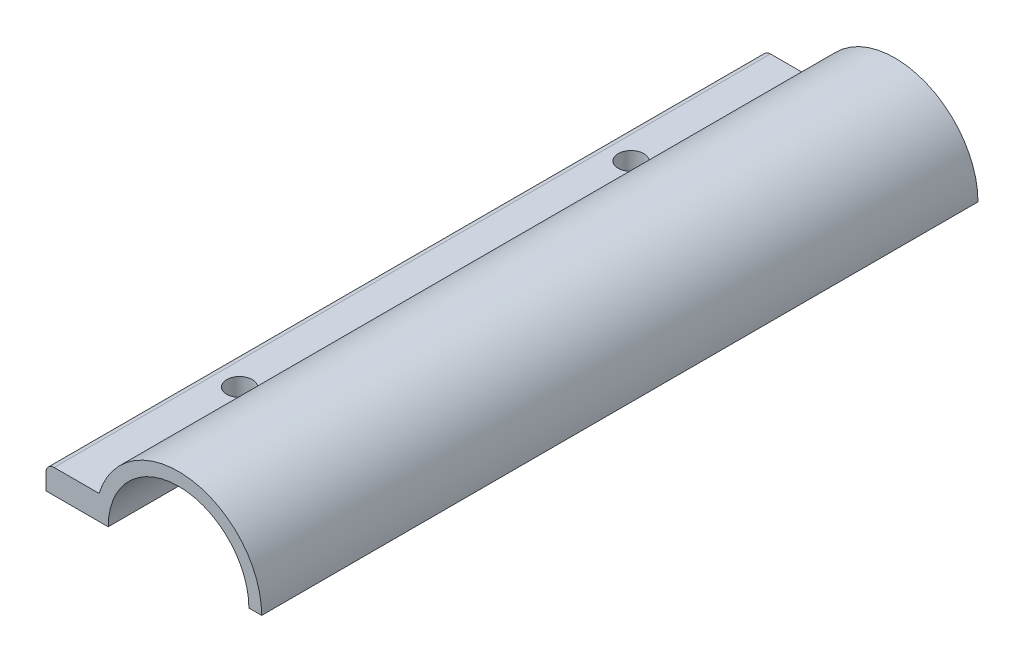
ISO-10303-21;
HEADER;
FILE_DESCRIPTION(('STEP AP214'),'2;1');
FILE_NAME('part.step','',(''),(''),'','','');
FILE_SCHEMA(('AUTOMOTIVE_DESIGN { 1 0 10303 214 1 1 1 1 }'));
ENDSEC;
DATA;
#1=APPLICATION_CONTEXT('core data for automotive mechanical design processes');
#2=APPLICATION_PROTOCOL_DEFINITION('international standard','automotive_design',2000,#1);
#3=PRODUCT_CONTEXT('',#1,'mechanical');
#4=PRODUCT('Part','Part','',(#3));
#5=PRODUCT_RELATED_PRODUCT_CATEGORY('part','',(#4));
#6=PRODUCT_DEFINITION_FORMATION('','',#4);
#7=PRODUCT_DEFINITION_CONTEXT('part definition',#1,'design');
#8=PRODUCT_DEFINITION('design','',#6,#7);
#9=PRODUCT_DEFINITION_SHAPE('','',#8);
#10=(LENGTH_UNIT() NAMED_UNIT(*) SI_UNIT(.MILLI.,.METRE.));
#11=(NAMED_UNIT(*) PLANE_ANGLE_UNIT() SI_UNIT($,.RADIAN.));
#12=(NAMED_UNIT(*) SI_UNIT($,.STERADIAN.) SOLID_ANGLE_UNIT());
#13=UNCERTAINTY_MEASURE_WITH_UNIT(LENGTH_MEASURE(1.E-05),#10,'distance_accuracy_value','');
#14=(GEOMETRIC_REPRESENTATION_CONTEXT(3) GLOBAL_UNCERTAINTY_ASSIGNED_CONTEXT((#13)) GLOBAL_UNIT_ASSIGNED_CONTEXT((#10,
#11,#12)) REPRESENTATION_CONTEXT('',''));
#15=CARTESIAN_POINT('',(0.,0.,0.));
#16=DIRECTION('',(0.,0.,1.));
#17=DIRECTION('',(1.,0.,0.));
#18=AXIS2_PLACEMENT_3D('',#15,#16,#17);
#19=CARTESIAN_POINT('',(0.,0.,112.));
#20=DIRECTION('',(0.,0.,-1.));
#21=DIRECTION('',(-1.,0.,0.));
#22=AXIS2_PLACEMENT_3D('',#19,#20,#21);
#23=CYLINDRICAL_SURFACE('',#22,11.);
#24=CARTESIAN_POINT('',(0.,0.,0.));
#25=DIRECTION('',(0.,0.,1.));
#26=DIRECTION('',(1.,0.,0.));
#27=AXIS2_PLACEMENT_3D('',#24,#25,#26);
#28=CIRCLE('',#27,11.);
#29=CARTESIAN_POINT('',(11.,0.,0.));
#30=VERTEX_POINT('',#29);
#31=CARTESIAN_POINT('',(-11.,0.,0.));
#32=VERTEX_POINT('',#31);
#33=EDGE_CURVE('E105',#30,#32,#28,.T.);
#34=ORIENTED_EDGE('',*,*,#33,.F.);
#35=DIRECTION('',(0.,0.,-1.));
#36=VECTOR('',#35,1.);
#37=CARTESIAN_POINT('',(11.,0.,112.));
#38=LINE('',#37,#36);
#39=CARTESIAN_POINT('',(11.,0.,112.));
#40=VERTEX_POINT('',#39);
#41=EDGE_CURVE('E100',#40,#30,#38,.T.);
#42=ORIENTED_EDGE('',*,*,#41,.F.);
#43=CARTESIAN_POINT('',(0.,0.,112.));
#44=DIRECTION('',(0.,0.,1.));
#45=DIRECTION('',(1.,0.,0.));
#46=AXIS2_PLACEMENT_3D('',#43,#44,#45);
#47=CIRCLE('',#46,11.);
#48=CARTESIAN_POINT('',(-11.,0.,112.));
#49=VERTEX_POINT('',#48);
#50=EDGE_CURVE('E103',#40,#49,#47,.T.);
#51=ORIENTED_EDGE('',*,*,#50,.T.);
#52=DIRECTION('',(0.,0.,-1.));
#53=VECTOR('',#52,1.);
#54=CARTESIAN_POINT('',(-11.,0.,112.));
#55=LINE('',#54,#53);
#56=EDGE_CURVE('E147',#49,#32,#55,.T.);
#57=ORIENTED_EDGE('',*,*,#56,.T.);
#58=EDGE_LOOP('',(#34,#42,#51,#57));
#59=FACE_BOUND('',#58,.T.);
#60=ADVANCED_FACE('F43',(#59),#23,.F.);
#61=CARTESIAN_POINT('',(0.,0.,112.));
#62=DIRECTION('',(0.,1.,0.));
#63=DIRECTION('',(0.,0.,1.));
#64=AXIS2_PLACEMENT_3D('',#61,#62,#63);
#65=PLANE('',#64);
#66=DIRECTION('',(1.,0.,0.));
#67=VECTOR('',#66,1.);
#68=CARTESIAN_POINT('',(0.,0.,0.));
#69=LINE('',#68,#67);
#70=CARTESIAN_POINT('',(13.,0.,0.));
#71=VERTEX_POINT('',#70);
#72=EDGE_CURVE('E129',#30,#71,#69,.T.);
#73=ORIENTED_EDGE('',*,*,#72,.T.);
#74=DIRECTION('',(0.,0.,-1.));
#75=VECTOR('',#74,1.);
#76=CARTESIAN_POINT('',(13.,0.,112.));
#77=LINE('',#76,#75);
#78=CARTESIAN_POINT('',(13.,0.,112.));
#79=VERTEX_POINT('',#78);
#80=EDGE_CURVE('E109',#79,#71,#77,.T.);
#81=ORIENTED_EDGE('',*,*,#80,.F.);
#82=DIRECTION('',(1.,0.,0.));
#83=VECTOR('',#82,1.);
#84=CARTESIAN_POINT('',(0.,0.,112.));
#85=LINE('',#84,#83);
#86=EDGE_CURVE('E112',#40,#79,#85,.T.);
#87=ORIENTED_EDGE('',*,*,#86,.F.);
#88=ORIENTED_EDGE('',*,*,#41,.T.);
#89=EDGE_LOOP('',(#73,#81,#87,#88));
#90=FACE_BOUND('',#89,.T.);
#91=ADVANCED_FACE('F113',(#90),#65,.F.);
#92=CARTESIAN_POINT('',(0.,0.,112.));
#93=DIRECTION('',(0.,0.,-1.));
#94=DIRECTION('',(-1.,0.,0.));
#95=AXIS2_PLACEMENT_3D('',#92,#93,#94);
#96=CYLINDRICAL_SURFACE('',#95,13.);
#97=CARTESIAN_POINT('',(0.,0.,0.));
#98=DIRECTION('',(0.,0.,1.));
#99=DIRECTION('',(1.,0.,0.));
#100=AXIS2_PLACEMENT_3D('',#97,#98,#99);
#101=CIRCLE('',#100,13.);
#102=CARTESIAN_POINT('',(-12.4291552408038,3.81,0.));
#103=VERTEX_POINT('',#102);
#104=EDGE_CURVE('E141',#71,#103,#101,.T.);
#105=ORIENTED_EDGE('',*,*,#104,.T.);
#106=DIRECTION('',(0.,0.,-1.));
#107=VECTOR('',#106,1.);
#108=CARTESIAN_POINT('',(-12.4291552408038,3.81,112.));
#109=LINE('',#108,#107);
#110=CARTESIAN_POINT('',(-12.4291552408038,3.81,112.));
#111=VERTEX_POINT('',#110);
#112=EDGE_CURVE('E152',#111,#103,#109,.T.);
#113=ORIENTED_EDGE('',*,*,#112,.F.);
#114=CARTESIAN_POINT('',(0.,0.,112.));
#115=DIRECTION('',(0.,0.,1.));
#116=DIRECTION('',(1.,0.,0.));
#117=AXIS2_PLACEMENT_3D('',#114,#115,#116);
#118=CIRCLE('',#117,13.);
#119=EDGE_CURVE('E118',#79,#111,#118,.T.);
#120=ORIENTED_EDGE('',*,*,#119,.F.);
#121=ORIENTED_EDGE('',*,*,#80,.T.);
#122=EDGE_LOOP('',(#105,#113,#120,#121));
#123=FACE_BOUND('',#122,.T.);
#124=ADVANCED_FACE('F185',(#123),#96,.T.);
#125=CARTESIAN_POINT('',(0.,3.81,112.));
#126=DIRECTION('',(0.,1.,0.));
#127=DIRECTION('',(0.,0.,1.));
#128=AXIS2_PLACEMENT_3D('',#125,#126,#127);
#129=PLANE('',#128);
#130=CARTESIAN_POINT('',(-15.862228892637,3.81,25.4));
#131=DIRECTION('',(0.,1.,0.));
#132=DIRECTION('',(0.,0.,1.));
#133=AXIS2_PLACEMENT_3D('',#130,#131,#132);
#134=CIRCLE('',#133,2.);
#135=CARTESIAN_POINT('',(-15.862228892637,3.81,27.4));
#136=VERTEX_POINT('',#135);
#137=EDGE_CURVE('E200',#136,#136,#134,.T.);
#138=ORIENTED_EDGE('',*,*,#137,.F.);
#139=EDGE_LOOP('',(#138));
#140=FACE_BOUND('',#139,.T.);
#141=CARTESIAN_POINT('',(-15.862228892637,3.81,86.6));
#142=DIRECTION('',(0.,1.,0.));
#143=DIRECTION('',(0.,0.,1.));
#144=AXIS2_PLACEMENT_3D('',#141,#142,#143);
#145=CIRCLE('',#144,2.);
#146=CARTESIAN_POINT('',(-15.862228892637,3.81,88.6));
#147=VERTEX_POINT('',#146);
#148=EDGE_CURVE('E203',#147,#147,#145,.T.);
#149=ORIENTED_EDGE('',*,*,#148,.F.);
#150=EDGE_LOOP('',(#149));
#151=FACE_BOUND('',#150,.T.);
#152=DIRECTION('',(1.,0.,0.));
#153=VECTOR('',#152,1.);
#154=CARTESIAN_POINT('',(0.,3.81,0.));
#155=LINE('',#154,#153);
#156=CARTESIAN_POINT('',(-19.4544577852741,3.81,0.));
#157=VERTEX_POINT('',#156);
#158=EDGE_CURVE('E144',#157,#103,#155,.T.);
#159=ORIENTED_EDGE('',*,*,#158,.F.);
#160=DIRECTION('',(0.,0.,-1.));
#161=VECTOR('',#160,1.);
#162=CARTESIAN_POINT('',(-19.4544577852741,3.81,112.));
#163=LINE('',#162,#161);
#164=CARTESIAN_POINT('',(-19.4544577852741,3.81,112.));
#165=VERTEX_POINT('',#164);
#166=EDGE_CURVE('E51',#157,#165,#163,.F.);
#167=ORIENTED_EDGE('',*,*,#166,.T.);
#168=DIRECTION('',(1.,0.,0.));
#169=VECTOR('',#168,1.);
#170=CARTESIAN_POINT('',(0.,3.81,112.));
#171=LINE('',#170,#169);
#172=EDGE_CURVE('E135',#165,#111,#171,.T.);
#173=ORIENTED_EDGE('',*,*,#172,.T.);
#174=ORIENTED_EDGE('',*,*,#112,.T.);
#175=EDGE_LOOP('',(#159,#167,#173,#174));
#176=FACE_BOUND('',#175,.T.);
#177=ADVANCED_FACE('F179',(#140,#151,#176),#129,.T.);
#178=CARTESIAN_POINT('',(-20.7244577852741,0.,112.));
#179=DIRECTION('',(1.,0.,0.));
#180=DIRECTION('',(0.,0.,-1.));
#181=AXIS2_PLACEMENT_3D('',#178,#179,#180);
#182=PLANE('',#181);
#183=DIRECTION('',(0.,-1.,0.));
#184=VECTOR('',#183,1.);
#185=CARTESIAN_POINT('',(-20.7244577852741,0.,112.));
#186=LINE('',#185,#184);
#187=CARTESIAN_POINT('',(-20.7244577852741,2.54,112.));
#188=VERTEX_POINT('',#187);
#189=CARTESIAN_POINT('',(-20.7244577852741,0.,112.));
#190=VERTEX_POINT('',#189);
#191=EDGE_CURVE('E137',#188,#190,#186,.T.);
#192=ORIENTED_EDGE('',*,*,#191,.F.);
#193=DIRECTION('',(0.,0.,-1.));
#194=VECTOR('',#193,1.);
#195=CARTESIAN_POINT('',(-20.7244577852741,2.54,0.));
#196=LINE('',#195,#194);
#197=CARTESIAN_POINT('',(-20.7244577852741,2.54,0.));
#198=VERTEX_POINT('',#197);
#199=EDGE_CURVE('E108',#188,#198,#196,.T.);
#200=ORIENTED_EDGE('',*,*,#199,.T.);
#201=DIRECTION('',(0.,-1.,0.));
#202=VECTOR('',#201,1.);
#203=CARTESIAN_POINT('',(-20.7244577852741,0.,0.));
#204=LINE('',#203,#202);
#205=CARTESIAN_POINT('',(-20.7244577852741,0.,0.));
#206=VERTEX_POINT('',#205);
#207=EDGE_CURVE('E127',#198,#206,#204,.T.);
#208=ORIENTED_EDGE('',*,*,#207,.T.);
#209=DIRECTION('',(0.,0.,-1.));
#210=VECTOR('',#209,1.);
#211=CARTESIAN_POINT('',(-20.7244577852741,0.,112.));
#212=LINE('',#211,#210);
#213=EDGE_CURVE('E149',#190,#206,#212,.T.);
#214=ORIENTED_EDGE('',*,*,#213,.F.);
#215=EDGE_LOOP('',(#192,#200,#208,#214));
#216=FACE_BOUND('',#215,.T.);
#217=ADVANCED_FACE('F161',(#216),#182,.F.);
#218=CARTESIAN_POINT('',(-15.862228892637,0.,25.4));
#219=DIRECTION('',(0.,1.,0.));
#220=DIRECTION('',(0.,0.,1.));
#221=AXIS2_PLACEMENT_3D('',#218,#219,#220);
#222=CIRCLE('',#221,2.);
#223=CARTESIAN_POINT('',(-15.862228892637,0.,27.4));
#224=VERTEX_POINT('',#223);
#225=EDGE_CURVE('E139',#224,#224,#222,.T.);
#226=ORIENTED_EDGE('',*,*,#225,.T.);
#227=EDGE_LOOP('',(#226));
#228=FACE_BOUND('',#227,.T.);
#229=CARTESIAN_POINT('',(-15.862228892637,0.,86.6));
#230=DIRECTION('',(0.,1.,0.));
#231=DIRECTION('',(0.,0.,1.));
#232=AXIS2_PLACEMENT_3D('',#229,#230,#231);
#233=CIRCLE('',#232,2.);
#234=CARTESIAN_POINT('',(-15.862228892637,0.,88.6));
#235=VERTEX_POINT('',#234);
#236=EDGE_CURVE('E131',#235,#235,#233,.T.);
#237=ORIENTED_EDGE('',*,*,#236,.T.);
#238=EDGE_LOOP('',(#237));
#239=FACE_BOUND('',#238,.T.);
#240=EDGE_CURVE('E124',#206,#32,#69,.T.);
#241=ORIENTED_EDGE('',*,*,#240,.T.);
#242=ORIENTED_EDGE('',*,*,#56,.F.);
#243=EDGE_CURVE('E120',#190,#49,#85,.T.);
#244=ORIENTED_EDGE('',*,*,#243,.F.);
#245=ORIENTED_EDGE('',*,*,#213,.T.);
#246=EDGE_LOOP('',(#241,#242,#244,#245));
#247=FACE_BOUND('',#246,.T.);
#248=ADVANCED_FACE('F168',(#228,#239,#247),#65,.F.);
#249=CARTESIAN_POINT('',(0.,0.,112.));
#250=DIRECTION('',(0.,0.,1.));
#251=DIRECTION('',(1.,0.,0.));
#252=AXIS2_PLACEMENT_3D('',#249,#250,#251);
#253=PLANE('',#252);
#254=ORIENTED_EDGE('',*,*,#172,.F.);
#255=CARTESIAN_POINT('',(-19.4544577852741,2.54,112.));
#256=DIRECTION('',(0.,0.,1.));
#257=DIRECTION('',(1.,0.,0.));
#258=AXIS2_PLACEMENT_3D('',#255,#256,#257);
#259=CIRCLE('',#258,1.27);
#260=EDGE_CURVE('E11',#165,#188,#259,.T.);
#261=ORIENTED_EDGE('',*,*,#260,.T.);
#262=ORIENTED_EDGE('',*,*,#191,.T.);
#263=ORIENTED_EDGE('',*,*,#243,.T.);
#264=ORIENTED_EDGE('',*,*,#50,.F.);
#265=ORIENTED_EDGE('',*,*,#86,.T.);
#266=ORIENTED_EDGE('',*,*,#119,.T.);
#267=EDGE_LOOP('',(#254,#261,#262,#263,#264,#265,#266));
#268=FACE_BOUND('',#267,.T.);
#269=ADVANCED_FACE('F121',(#268),#253,.T.);
#270=CARTESIAN_POINT('',(0.,0.,0.));
#271=DIRECTION('',(0.,0.,1.));
#272=DIRECTION('',(1.,0.,0.));
#273=AXIS2_PLACEMENT_3D('',#270,#271,#272);
#274=PLANE('',#273);
#275=ORIENTED_EDGE('',*,*,#207,.F.);
#276=CARTESIAN_POINT('',(-19.4544577852741,2.54,0.));
#277=DIRECTION('',(0.,0.,1.));
#278=DIRECTION('',(1.,0.,0.));
#279=AXIS2_PLACEMENT_3D('',#276,#277,#278);
#280=CIRCLE('',#279,1.27);
#281=EDGE_CURVE('E65',#198,#157,#280,.F.);
#282=ORIENTED_EDGE('',*,*,#281,.T.);
#283=ORIENTED_EDGE('',*,*,#158,.T.);
#284=ORIENTED_EDGE('',*,*,#104,.F.);
#285=ORIENTED_EDGE('',*,*,#72,.F.);
#286=ORIENTED_EDGE('',*,*,#33,.T.);
#287=ORIENTED_EDGE('',*,*,#240,.F.);
#288=EDGE_LOOP('',(#275,#282,#283,#284,#285,#286,#287));
#289=FACE_BOUND('',#288,.T.);
#290=ADVANCED_FACE('F166',(#289),#274,.F.);
#291=CARTESIAN_POINT('',(-15.862228892637,0.,86.6));
#292=DIRECTION('',(0.,1.,0.));
#293=DIRECTION('',(0.,0.,1.));
#294=AXIS2_PLACEMENT_3D('',#291,#292,#293);
#295=CYLINDRICAL_SURFACE('',#294,2.);
#296=CARTESIAN_POINT('',(-15.862228892637,0.,88.6));
#297=CARTESIAN_POINT('',(-15.862228892637,0.039687499999999,88.6));
#298=CARTESIAN_POINT('',(-15.862228892637,0.0793749999999991,88.6));
#299=CARTESIAN_POINT('',(-15.862228892637,0.158749999999999,88.6));
#300=CARTESIAN_POINT('',(-15.862228892637,0.198437499999999,88.6));
#301=CARTESIAN_POINT('',(-15.862228892637,0.277812499999999,88.6));
#302=CARTESIAN_POINT('',(-15.862228892637,0.317499999999999,88.6));
#303=CARTESIAN_POINT('',(-15.862228892637,0.396874999999999,88.6));
#304=CARTESIAN_POINT('',(-15.862228892637,0.436562499999999,88.6));
#305=CARTESIAN_POINT('',(-15.862228892637,0.515937499999999,88.6));
#306=CARTESIAN_POINT('',(-15.862228892637,0.555624999999999,88.6));
#307=CARTESIAN_POINT('',(-15.862228892637,0.634999999999999,88.6));
#308=CARTESIAN_POINT('',(-15.862228892637,0.674687499999999,88.6));
#309=CARTESIAN_POINT('',(-15.862228892637,0.754062499999999,88.6));
#310=CARTESIAN_POINT('',(-15.862228892637,0.793749999999999,88.6));
#311=CARTESIAN_POINT('',(-15.862228892637,0.873124999999999,88.6));
#312=CARTESIAN_POINT('',(-15.862228892637,0.912812499999999,88.6));
#313=CARTESIAN_POINT('',(-15.862228892637,0.992187499999999,88.6));
#314=CARTESIAN_POINT('',(-15.862228892637,1.031875,88.6));
#315=CARTESIAN_POINT('',(-15.862228892637,1.11125,88.6));
#316=CARTESIAN_POINT('',(-15.862228892637,1.1509375,88.6));
#317=CARTESIAN_POINT('',(-15.862228892637,1.2303125,88.6));
#318=CARTESIAN_POINT('',(-15.862228892637,1.27,88.6));
#319=CARTESIAN_POINT('',(-15.862228892637,1.349375,88.6));
#320=CARTESIAN_POINT('',(-15.862228892637,1.3890625,88.6));
#321=CARTESIAN_POINT('',(-15.862228892637,1.4684375,88.6));
#322=CARTESIAN_POINT('',(-15.862228892637,1.508125,88.6));
#323=CARTESIAN_POINT('',(-15.862228892637,1.5875,88.6));
#324=CARTESIAN_POINT('',(-15.862228892637,1.6271875,88.6));
#325=CARTESIAN_POINT('',(-15.862228892637,1.7065625,88.6));
#326=CARTESIAN_POINT('',(-15.862228892637,1.74625,88.6));
#327=CARTESIAN_POINT('',(-15.862228892637,1.825625,88.6));
#328=CARTESIAN_POINT('',(-15.862228892637,1.8653125,88.6));
#329=CARTESIAN_POINT('',(-15.862228892637,1.9446875,88.6));
#330=CARTESIAN_POINT('',(-15.862228892637,1.984375,88.6));
#331=CARTESIAN_POINT('',(-15.862228892637,2.06375,88.6));
#332=CARTESIAN_POINT('',(-15.862228892637,2.1034375,88.6));
#333=CARTESIAN_POINT('',(-15.862228892637,2.1828125,88.6));
#334=CARTESIAN_POINT('',(-15.862228892637,2.2225,88.6));
#335=CARTESIAN_POINT('',(-15.862228892637,2.301875,88.6));
#336=CARTESIAN_POINT('',(-15.862228892637,2.3415625,88.6));
#337=CARTESIAN_POINT('',(-15.862228892637,2.4209375,88.6));
#338=CARTESIAN_POINT('',(-15.862228892637,2.460625,88.6));
#339=CARTESIAN_POINT('',(-15.862228892637,2.54,88.6));
#340=CARTESIAN_POINT('',(-15.862228892637,2.5796875,88.6));
#341=CARTESIAN_POINT('',(-15.862228892637,2.6590625,88.6));
#342=CARTESIAN_POINT('',(-15.862228892637,2.69875,88.6));
#343=CARTESIAN_POINT('',(-15.862228892637,2.778125,88.6));
#344=CARTESIAN_POINT('',(-15.862228892637,2.8178125,88.6));
#345=CARTESIAN_POINT('',(-15.862228892637,2.8971875,88.6));
#346=CARTESIAN_POINT('',(-15.862228892637,2.936875,88.6));
#347=CARTESIAN_POINT('',(-15.862228892637,3.01625,88.6));
#348=CARTESIAN_POINT('',(-15.862228892637,3.0559375,88.6));
#349=CARTESIAN_POINT('',(-15.862228892637,3.1353125,88.6));
#350=CARTESIAN_POINT('',(-15.862228892637,3.175,88.6));
#351=CARTESIAN_POINT('',(-15.862228892637,3.254375,88.6));
#352=CARTESIAN_POINT('',(-15.862228892637,3.2940625,88.6));
#353=CARTESIAN_POINT('',(-15.862228892637,3.3734375,88.6));
#354=CARTESIAN_POINT('',(-15.862228892637,3.413125,88.6));
#355=CARTESIAN_POINT('',(-15.862228892637,3.4925,88.6));
#356=CARTESIAN_POINT('',(-15.862228892637,3.5321875,88.6));
#357=CARTESIAN_POINT('',(-15.862228892637,3.6115625,88.6));
#358=CARTESIAN_POINT('',(-15.862228892637,3.65125,88.6));
#359=CARTESIAN_POINT('',(-15.862228892637,3.730625,88.6));
#360=CARTESIAN_POINT('',(-15.862228892637,3.7703125,88.6));
#361=CARTESIAN_POINT('',(-15.862228892637,3.81,88.6));
#362=B_SPLINE_CURVE_WITH_KNOTS('',3,(#296,#297,#298,#299,#300,#301,#302,#303,#304,#305,#306,
#307,#308,#309,#310,#311,#312,#313,#314,#315,#316,#317,#318,#319,#320,#321,#322,#323,#324,#325,
#326,#327,#328,#329,#330,#331,#332,#333,#334,#335,#336,#337,#338,#339,#340,#341,#342,#343,#344,
#345,#346,#347,#348,#349,#350,#351,#352,#353,#354,#355,#356,#357,#358,#359,#360,#361),
.UNSPECIFIED.,.F.,.F.,(4,2,2,2,2,2,2,2,2,2,2,2,2,2,2,2,2,2,2,2,2,2,2,2,2,2,2,2,2,2,2,2,4),(0.,
0.1190625,0.238125,0.3571875,0.47625,0.5953125,0.714375,0.8334375,0.9525,1.0715625,1.190625,
1.3096875,1.42875,1.5478125,1.666875,1.7859375,1.905,2.0240625,2.143125,2.2621875,2.38125,
2.5003125,2.619375,2.7384375,2.8575,2.9765625,3.095625,3.2146875,3.33375,3.4528125,3.571875,
3.6909375,3.81),.UNSPECIFIED.);
#363=EDGE_CURVE('BSEAM211',#235,#147,#362,.T.);
#364=ORIENTED_EDGE('',*,*,#236,.F.);
#365=ORIENTED_EDGE('',*,*,#148,.T.);
#366=ORIENTED_EDGE('',*,*,#363,.T.);
#367=ORIENTED_EDGE('',*,*,#363,.F.);
#368=EDGE_LOOP('',(#364,#366,#365,#367));
#369=FACE_BOUND('',#368,.T.);
#370=ADVANCED_FACE('F211',(#369),#295,.F.);
#371=CARTESIAN_POINT('',(-15.862228892637,0.,25.4));
#372=DIRECTION('',(0.,1.,0.));
#373=DIRECTION('',(0.,0.,1.));
#374=AXIS2_PLACEMENT_3D('',#371,#372,#373);
#375=CYLINDRICAL_SURFACE('',#374,2.);
#376=CARTESIAN_POINT('',(-15.862228892637,0.,27.4));
#377=CARTESIAN_POINT('',(-15.862228892637,0.039687499999999,27.4));
#378=CARTESIAN_POINT('',(-15.862228892637,0.0793749999999991,27.4));
#379=CARTESIAN_POINT('',(-15.862228892637,0.158749999999999,27.4));
#380=CARTESIAN_POINT('',(-15.862228892637,0.198437499999999,27.4));
#381=CARTESIAN_POINT('',(-15.862228892637,0.277812499999999,27.4));
#382=CARTESIAN_POINT('',(-15.862228892637,0.317499999999999,27.4));
#383=CARTESIAN_POINT('',(-15.862228892637,0.396874999999999,27.4));
#384=CARTESIAN_POINT('',(-15.862228892637,0.436562499999999,27.4));
#385=CARTESIAN_POINT('',(-15.862228892637,0.515937499999999,27.4));
#386=CARTESIAN_POINT('',(-15.862228892637,0.555624999999999,27.4));
#387=CARTESIAN_POINT('',(-15.862228892637,0.634999999999999,27.4));
#388=CARTESIAN_POINT('',(-15.862228892637,0.674687499999999,27.4));
#389=CARTESIAN_POINT('',(-15.862228892637,0.754062499999999,27.4));
#390=CARTESIAN_POINT('',(-15.862228892637,0.793749999999999,27.4));
#391=CARTESIAN_POINT('',(-15.862228892637,0.873124999999999,27.4));
#392=CARTESIAN_POINT('',(-15.862228892637,0.912812499999999,27.4));
#393=CARTESIAN_POINT('',(-15.862228892637,0.992187499999999,27.4));
#394=CARTESIAN_POINT('',(-15.862228892637,1.031875,27.4));
#395=CARTESIAN_POINT('',(-15.862228892637,1.11125,27.4));
#396=CARTESIAN_POINT('',(-15.862228892637,1.1509375,27.4));
#397=CARTESIAN_POINT('',(-15.862228892637,1.2303125,27.4));
#398=CARTESIAN_POINT('',(-15.862228892637,1.27,27.4));
#399=CARTESIAN_POINT('',(-15.862228892637,1.349375,27.4));
#400=CARTESIAN_POINT('',(-15.862228892637,1.3890625,27.4));
#401=CARTESIAN_POINT('',(-15.862228892637,1.4684375,27.4));
#402=CARTESIAN_POINT('',(-15.862228892637,1.508125,27.4));
#403=CARTESIAN_POINT('',(-15.862228892637,1.5875,27.4));
#404=CARTESIAN_POINT('',(-15.862228892637,1.6271875,27.4));
#405=CARTESIAN_POINT('',(-15.862228892637,1.7065625,27.4));
#406=CARTESIAN_POINT('',(-15.862228892637,1.74625,27.4));
#407=CARTESIAN_POINT('',(-15.862228892637,1.825625,27.4));
#408=CARTESIAN_POINT('',(-15.862228892637,1.8653125,27.4));
#409=CARTESIAN_POINT('',(-15.862228892637,1.9446875,27.4));
#410=CARTESIAN_POINT('',(-15.862228892637,1.984375,27.4));
#411=CARTESIAN_POINT('',(-15.862228892637,2.06375,27.4));
#412=CARTESIAN_POINT('',(-15.862228892637,2.1034375,27.4));
#413=CARTESIAN_POINT('',(-15.862228892637,2.1828125,27.4));
#414=CARTESIAN_POINT('',(-15.862228892637,2.2225,27.4));
#415=CARTESIAN_POINT('',(-15.862228892637,2.301875,27.4));
#416=CARTESIAN_POINT('',(-15.862228892637,2.3415625,27.4));
#417=CARTESIAN_POINT('',(-15.862228892637,2.4209375,27.4));
#418=CARTESIAN_POINT('',(-15.862228892637,2.460625,27.4));
#419=CARTESIAN_POINT('',(-15.862228892637,2.54,27.4));
#420=CARTESIAN_POINT('',(-15.862228892637,2.5796875,27.4));
#421=CARTESIAN_POINT('',(-15.862228892637,2.6590625,27.4));
#422=CARTESIAN_POINT('',(-15.862228892637,2.69875,27.4));
#423=CARTESIAN_POINT('',(-15.862228892637,2.778125,27.4));
#424=CARTESIAN_POINT('',(-15.862228892637,2.8178125,27.4));
#425=CARTESIAN_POINT('',(-15.862228892637,2.8971875,27.4));
#426=CARTESIAN_POINT('',(-15.862228892637,2.936875,27.4));
#427=CARTESIAN_POINT('',(-15.862228892637,3.01625,27.4));
#428=CARTESIAN_POINT('',(-15.862228892637,3.0559375,27.4));
#429=CARTESIAN_POINT('',(-15.862228892637,3.1353125,27.4));
#430=CARTESIAN_POINT('',(-15.862228892637,3.175,27.4));
#431=CARTESIAN_POINT('',(-15.862228892637,3.254375,27.4));
#432=CARTESIAN_POINT('',(-15.862228892637,3.2940625,27.4));
#433=CARTESIAN_POINT('',(-15.862228892637,3.3734375,27.4));
#434=CARTESIAN_POINT('',(-15.862228892637,3.413125,27.4));
#435=CARTESIAN_POINT('',(-15.862228892637,3.4925,27.4));
#436=CARTESIAN_POINT('',(-15.862228892637,3.5321875,27.4));
#437=CARTESIAN_POINT('',(-15.862228892637,3.6115625,27.4));
#438=CARTESIAN_POINT('',(-15.862228892637,3.65125,27.4));
#439=CARTESIAN_POINT('',(-15.862228892637,3.730625,27.4));
#440=CARTESIAN_POINT('',(-15.862228892637,3.7703125,27.4));
#441=CARTESIAN_POINT('',(-15.862228892637,3.81,27.4));
#442=B_SPLINE_CURVE_WITH_KNOTS('',3,(#376,#377,#378,#379,#380,#381,#382,#383,#384,#385,#386,
#387,#388,#389,#390,#391,#392,#393,#394,#395,#396,#397,#398,#399,#400,#401,#402,#403,#404,#405,
#406,#407,#408,#409,#410,#411,#412,#413,#414,#415,#416,#417,#418,#419,#420,#421,#422,#423,#424,
#425,#426,#427,#428,#429,#430,#431,#432,#433,#434,#435,#436,#437,#438,#439,#440,#441),
.UNSPECIFIED.,.F.,.F.,(4,2,2,2,2,2,2,2,2,2,2,2,2,2,2,2,2,2,2,2,2,2,2,2,2,2,2,2,2,2,2,2,4),(0.,
0.1190625,0.238125,0.3571875,0.47625,0.5953125,0.714375,0.8334375,0.9525,1.0715625,1.190625,
1.3096875,1.42875,1.5478125,1.666875,1.7859375,1.905,2.0240625,2.143125,2.2621875,2.38125,
2.5003125,2.619375,2.7384375,2.8575,2.9765625,3.095625,3.2146875,3.33375,3.4528125,3.571875,
3.6909375,3.81),.UNSPECIFIED.);
#443=EDGE_CURVE('BSEAM207',#224,#136,#442,.T.);
#444=ORIENTED_EDGE('',*,*,#225,.F.);
#445=ORIENTED_EDGE('',*,*,#137,.T.);
#446=ORIENTED_EDGE('',*,*,#443,.T.);
#447=ORIENTED_EDGE('',*,*,#443,.F.);
#448=EDGE_LOOP('',(#444,#446,#445,#447));
#449=FACE_BOUND('',#448,.T.);
#450=ADVANCED_FACE('F207',(#449),#375,.F.);
#451=CARTESIAN_POINT('',(-19.4544577852741,2.54,112.));
#452=DIRECTION('',(0.,0.,1.));
#453=DIRECTION('',(1.,0.,0.));
#454=AXIS2_PLACEMENT_3D('',#451,#452,#453);
#455=CYLINDRICAL_SURFACE('',#454,1.27);
#456=ORIENTED_EDGE('',*,*,#260,.F.);
#457=ORIENTED_EDGE('',*,*,#166,.F.);
#458=ORIENTED_EDGE('',*,*,#281,.F.);
#459=ORIENTED_EDGE('',*,*,#199,.F.);
#460=EDGE_LOOP('',(#456,#457,#458,#459));
#461=FACE_BOUND('',#460,.T.);
#462=ADVANCED_FACE('F45',(#461),#455,.T.);
#463=CLOSED_SHELL('',(#60,#91,#124,#177,#217,#248,#269,#290,#370,#450,#462));
#464=MANIFOLD_SOLID_BREP('B2',#463);
#465=ADVANCED_BREP_SHAPE_REPRESENTATION('',(#18,#464),#14);
#466=SHAPE_DEFINITION_REPRESENTATION(#9,#465);
ENDSEC;
END-ISO-10303-21;
